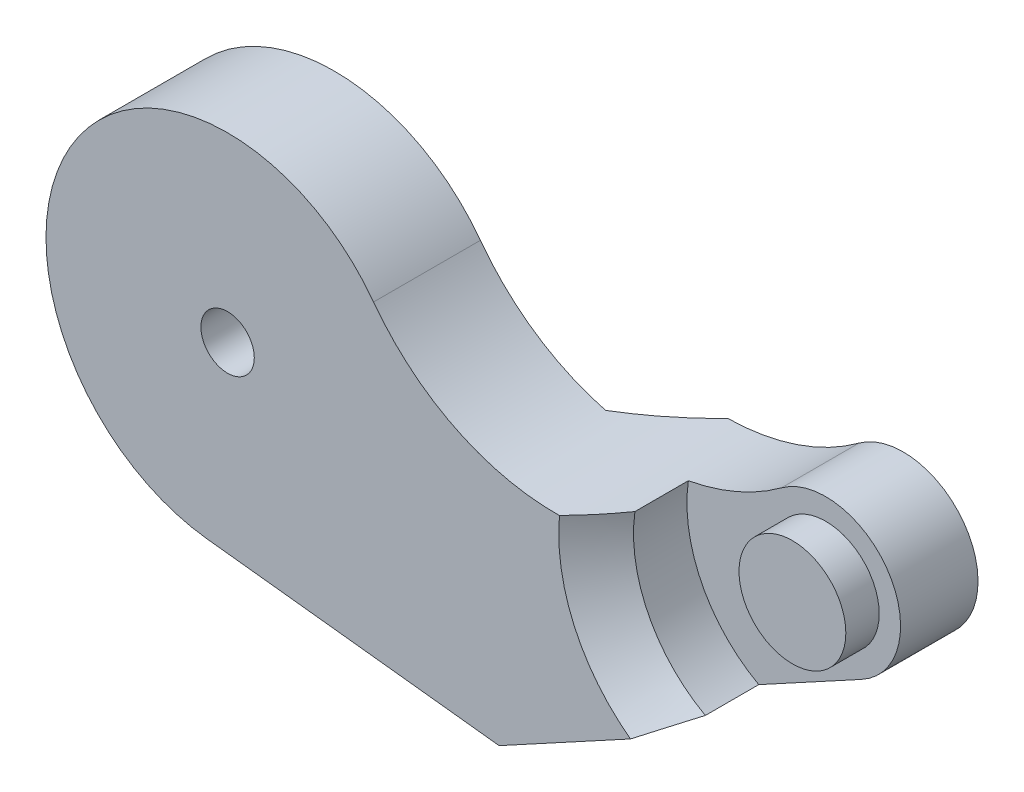
ISO-10303-21;
HEADER;
FILE_DESCRIPTION(('STEP AP214'),'2;1');
FILE_NAME('part.step','',(''),(''),'','','');
FILE_SCHEMA(('AUTOMOTIVE_DESIGN { 1 0 10303 214 1 1 1 1 }'));
ENDSEC;
DATA;
#1=APPLICATION_CONTEXT('core data for automotive mechanical design processes');
#2=APPLICATION_PROTOCOL_DEFINITION('international standard','automotive_design',2000,#1);
#3=PRODUCT_CONTEXT('',#1,'mechanical');
#4=PRODUCT('Part','Part','',(#3));
#5=PRODUCT_RELATED_PRODUCT_CATEGORY('part','',(#4));
#6=PRODUCT_DEFINITION_FORMATION('','',#4);
#7=PRODUCT_DEFINITION_CONTEXT('part definition',#1,'design');
#8=PRODUCT_DEFINITION('design','',#6,#7);
#9=PRODUCT_DEFINITION_SHAPE('','',#8);
#10=(LENGTH_UNIT() NAMED_UNIT(*) SI_UNIT(.MILLI.,.METRE.));
#11=(NAMED_UNIT(*) PLANE_ANGLE_UNIT() SI_UNIT($,.RADIAN.));
#12=(NAMED_UNIT(*) SI_UNIT($,.STERADIAN.) SOLID_ANGLE_UNIT());
#13=UNCERTAINTY_MEASURE_WITH_UNIT(LENGTH_MEASURE(1.E-05),#10,'distance_accuracy_value','');
#14=(GEOMETRIC_REPRESENTATION_CONTEXT(3) GLOBAL_UNCERTAINTY_ASSIGNED_CONTEXT((#13)) GLOBAL_UNIT_ASSIGNED_CONTEXT((#10,
#11,#12)) REPRESENTATION_CONTEXT('',''));
#15=CARTESIAN_POINT('',(0.,0.,0.));
#16=DIRECTION('',(0.,0.,1.));
#17=DIRECTION('',(1.,0.,0.));
#18=AXIS2_PLACEMENT_3D('',#15,#16,#17);
#19=CARTESIAN_POINT('',(190.,0.,-40.));
#20=DIRECTION('',(0.,0.,1.));
#21=DIRECTION('',(1.,0.,0.));
#22=AXIS2_PLACEMENT_3D('',#19,#20,#21);
#23=CYLINDRICAL_SURFACE('',#22,28.);
#24=DIRECTION('',(0.,0.,1.));
#25=VECTOR('',#24,1.);
#26=CARTESIAN_POINT('',(173.398230088496,22.5473110548789,-40.));
#27=LINE('',#26,#25);
#28=CARTESIAN_POINT('',(173.398230088496,22.5473110548789,-63.));
#29=VERTEX_POINT('',#28);
#30=CARTESIAN_POINT('',(173.398230088496,22.5473110548789,-34.));
#31=VERTEX_POINT('',#30);
#32=EDGE_CURVE('E183',#29,#31,#27,.T.);
#33=ORIENTED_EDGE('',*,*,#32,.T.);
#34=CARTESIAN_POINT('',(190.,0.,-34.));
#35=DIRECTION('',(0.,0.,1.));
#36=DIRECTION('',(1.,0.,0.));
#37=AXIS2_PLACEMENT_3D('',#34,#35,#36);
#38=CIRCLE('',#37,28.);
#39=CARTESIAN_POINT('',(203.380425875197,-24.5960200723279,-34.));
#40=VERTEX_POINT('',#39);
#41=EDGE_CURVE('E131',#31,#40,#38,.F.);
#42=ORIENTED_EDGE('',*,*,#41,.T.);
#43=DIRECTION('',(0.,0.,1.));
#44=VECTOR('',#43,1.);
#45=CARTESIAN_POINT('',(203.380425875197,-24.5960200723279,-40.));
#46=LINE('',#45,#44);
#47=CARTESIAN_POINT('',(203.380425875197,-24.5960200723279,-63.));
#48=VERTEX_POINT('',#47);
#49=EDGE_CURVE('E121',#48,#40,#46,.T.);
#50=ORIENTED_EDGE('',*,*,#49,.F.);
#51=CARTESIAN_POINT('',(190.,0.,-63.));
#52=DIRECTION('',(0.,0.,1.));
#53=DIRECTION('',(1.,0.,0.));
#54=AXIS2_PLACEMENT_3D('',#51,#52,#53);
#55=CIRCLE('',#54,28.);
#56=EDGE_CURVE('E124',#48,#29,#55,.T.);
#57=ORIENTED_EDGE('',*,*,#56,.T.);
#58=EDGE_LOOP('',(#33,#42,#50,#57));
#59=FACE_BOUND('',#58,.T.);
#60=ADVANCED_FACE('F41',(#59),#23,.T.);
#61=CARTESIAN_POINT('',(203.380425875197,-24.5960200723279,-40.));
#62=DIRECTION('',(-0.477872352685612,0.878429288297424,0.));
#63=DIRECTION('',(-0.878429288297424,-0.477872352685612,0.));
#64=AXIS2_PLACEMENT_3D('',#61,#62,#63);
#65=PLANE('',#64);
#66=DIRECTION('',(0.,0.,1.));
#67=VECTOR('',#66,1.);
#68=CARTESIAN_POINT('',(101.660038140553,-79.9327007254307,-40.));
#69=LINE('',#68,#67);
#70=CARTESIAN_POINT('',(101.660038140553,-79.9327007254307,-50.0637693932153));
#71=VERTEX_POINT('',#70);
#72=CARTESIAN_POINT('',(101.660038140553,-79.9327007254307,0.));
#73=VERTEX_POINT('',#72);
#74=EDGE_CURVE('E134',#71,#73,#69,.T.);
#75=ORIENTED_EDGE('',*,*,#74,.F.);
#76=DIRECTION('',(0.679543517203143,0.369676949123047,-0.633687274224643));
#77=VECTOR('',#76,1.);
#78=CARTESIAN_POINT('',(119.935341924948,-69.9907935829449,-67.1058382932682));
#79=LINE('',#78,#77);
#80=CARTESIAN_POINT('',(115.532388120504,-72.3860346357263,-63.));
#81=VERTEX_POINT('',#80);
#82=EDGE_CURVE('E65',#71,#81,#79,.T.);
#83=ORIENTED_EDGE('',*,*,#82,.T.);
#84=DIRECTION('',(0.878429288297424,0.477872352685612,0.));
#85=VECTOR('',#84,1.);
#86=CARTESIAN_POINT('',(203.380425875197,-24.5960200723279,-63.));
#87=LINE('',#86,#85);
#88=EDGE_CURVE('E117',#81,#48,#87,.T.);
#89=ORIENTED_EDGE('',*,*,#88,.T.);
#90=ORIENTED_EDGE('',*,*,#49,.T.);
#91=DIRECTION('',(0.878429288297424,0.477872352685612,0.));
#92=VECTOR('',#91,1.);
#93=CARTESIAN_POINT('',(203.380425875197,-24.5960200723279,-34.));
#94=LINE('',#93,#92);
#95=CARTESIAN_POINT('',(164.889582965301,-45.5353374462458,-34.));
#96=VERTEX_POINT('',#95);
#97=EDGE_CURVE('E166',#96,#40,#94,.T.);
#98=ORIENTED_EDGE('',*,*,#97,.F.);
#99=DIRECTION('',(0.,0.,1.));
#100=VECTOR('',#99,1.);
#101=CARTESIAN_POINT('',(164.889582965301,-45.5353374462458,-34.));
#102=LINE('',#101,#100);
#103=CARTESIAN_POINT('',(164.889582965301,-45.5353374462458,-14.));
#104=VERTEX_POINT('',#103);
#105=EDGE_CURVE('E160',#96,#104,#102,.T.);
#106=ORIENTED_EDGE('',*,*,#105,.T.);
#107=CARTESIAN_POINT('',(164.889582965301,-45.5353374462458,-14.));
#108=CARTESIAN_POINT('',(164.295552922547,-45.8584944013682,-13.4301454491174));
#109=CARTESIAN_POINT('',(163.70316383095,-46.1807586663217,-12.85807998458));
#110=CARTESIAN_POINT('',(162.521372217462,-46.8236624791218,-11.7099746927511));
#111=CARTESIAN_POINT('',(161.931969672641,-47.1443020394426,-11.1339348960543));
#112=CARTESIAN_POINT('',(160.755891432452,-47.784097732811,-9.97836358566463));
#113=CARTESIAN_POINT('',(160.169215533042,-48.1032539768594,-9.39883234094978));
#114=CARTESIAN_POINT('',(158.998293540993,-48.7402446312078,-8.23659633161433));
#115=CARTESIAN_POINT('',(158.414047453315,-49.0580790388096,-7.65389156052135));
#116=CARTESIAN_POINT('',(156.664641301999,-50.0097695669713,-5.9015429022758));
#117=CARTESIAN_POINT('',(155.502778358574,-50.641832028537,-4.72763022106569));
#118=CARTESIAN_POINT('',(153.765419487204,-51.5869687428759,-2.95974978929616));
#119=CARTESIAN_POINT('',(153.187182884498,-51.9015339439973,-2.36926410567707));
#120=CARTESIAN_POINT('',(152.032388240096,-52.5297511960182,-1.18617252637002));
#121=CARTESIAN_POINT('',(151.455830194224,-52.8434032491903,-0.593566635966684));
#122=CARTESIAN_POINT('',(150.880035515388,-53.1566400247676,0.));
#123=B_SPLINE_CURVE_WITH_KNOTS('',3,(#107,#108,#109,#110,#111,#112,#113,#114,#115,#116,#117,
#118,#119,#120,#121,#122),.UNSPECIFIED.,.F.,.F.,(4,2,2,2,2,2,2,4),(0.,2.65297422851289,
5.30592805700072,7.95868005330752,10.6114374619152,15.9167942925514,18.5696838608918,
21.2225668214801),.UNSPECIFIED.);
#124=CARTESIAN_POINT('',(150.880035515388,-53.1566400247676,0.));
#125=VERTEX_POINT('',#124);
#126=EDGE_CURVE('E215',#104,#125,#123,.T.);
#127=ORIENTED_EDGE('',*,*,#126,.T.);
#128=DIRECTION('',(-0.878429288297424,-0.477872352685612,0.));
#129=VECTOR('',#128,1.);
#130=CARTESIAN_POINT('',(203.380425875197,-24.5960200723279,0.));
#131=LINE('',#130,#129);
#132=EDGE_CURVE('E175',#125,#73,#131,.T.);
#133=ORIENTED_EDGE('',*,*,#132,.T.);
#134=EDGE_LOOP('',(#75,#83,#89,#90,#98,#106,#127,#133));
#135=FACE_BOUND('',#134,.T.);
#136=ADVANCED_FACE('F119',(#135),#65,.F.);
#137=CARTESIAN_POINT('',(-7.64294337863569,-67.5691158482259,-40.));
#138=DIRECTION('',(-0.112396226156407,-0.993663468356263,0.));
#139=DIRECTION('',(0.993663468356263,-0.112396226156407,0.));
#140=AXIS2_PLACEMENT_3D('',#137,#138,#139);
#141=PLANE('',#140);
#142=DIRECTION('',(0.993663468356263,-0.112396226156407,0.));
#143=VECTOR('',#142,1.);
#144=CARTESIAN_POINT('',(-7.64294337863569,-67.5691158482259,-40.));
#145=LINE('',#144,#143);
#146=CARTESIAN_POINT('',(-7.64294337863569,-67.5691158482259,-40.));
#147=VERTEX_POINT('',#146);
#148=CARTESIAN_POINT('',(91.6600381405532,-78.801571024725,-40.));
#149=VERTEX_POINT('',#148);
#150=EDGE_CURVE('E179',#147,#149,#145,.T.);
#151=ORIENTED_EDGE('',*,*,#150,.T.);
#152=DIRECTION('',(0.702626176692058,-0.0794761336949726,-0.707106781186547));
#153=VECTOR('',#152,1.);
#154=CARTESIAN_POINT('',(42.0085473809587,-73.1853434364754,9.96811530339233));
#155=LINE('',#154,#153);
#156=EDGE_CURVE('E259',#149,#71,#155,.T.);
#157=ORIENTED_EDGE('',*,*,#156,.T.);
#158=ORIENTED_EDGE('',*,*,#74,.T.);
#159=DIRECTION('',(0.993663468356263,-0.112396226156407,0.));
#160=VECTOR('',#159,1.);
#161=CARTESIAN_POINT('',(-7.64294337863569,-67.5691158482259,0.));
#162=LINE('',#161,#160);
#163=CARTESIAN_POINT('',(-7.64294337863569,-67.5691158482259,0.));
#164=VERTEX_POINT('',#163);
#165=EDGE_CURVE('E191',#164,#73,#162,.T.);
#166=ORIENTED_EDGE('',*,*,#165,.F.);
#167=DIRECTION('',(0.,0.,1.));
#168=VECTOR('',#167,1.);
#169=CARTESIAN_POINT('',(-7.64294337863569,-67.5691158482259,-40.));
#170=LINE('',#169,#168);
#171=EDGE_CURVE('E200',#147,#164,#170,.T.);
#172=ORIENTED_EDGE('',*,*,#171,.F.);
#173=EDGE_LOOP('',(#151,#157,#158,#166,#172));
#174=FACE_BOUND('',#173,.T.);
#175=ADVANCED_FACE('F233',(#174),#141,.T.);
#176=CARTESIAN_POINT('',(0.,0.,-40.));
#177=DIRECTION('',(0.,0.,1.));
#178=DIRECTION('',(1.,0.,0.));
#179=AXIS2_PLACEMENT_3D('',#176,#177,#178);
#180=CYLINDRICAL_SURFACE('',#179,68.);
#181=CARTESIAN_POINT('',(0.,0.,0.));
#182=DIRECTION('',(0.,0.,1.));
#183=DIRECTION('',(1.,0.,0.));
#184=AXIS2_PLACEMENT_3D('',#181,#182,#183);
#185=CIRCLE('',#184,68.);
#186=CARTESIAN_POINT('',(54.6666666666667,40.442002368275,0.));
#187=VERTEX_POINT('',#186);
#188=EDGE_CURVE('E187',#187,#164,#185,.T.);
#189=ORIENTED_EDGE('',*,*,#188,.F.);
#190=DIRECTION('',(0.,0.,1.));
#191=VECTOR('',#190,1.);
#192=CARTESIAN_POINT('',(54.6666666666667,40.442002368275,-40.));
#193=LINE('',#192,#191);
#194=CARTESIAN_POINT('',(54.6666666666667,40.442002368275,-40.));
#195=VERTEX_POINT('',#194);
#196=EDGE_CURVE('E203',#195,#187,#193,.T.);
#197=ORIENTED_EDGE('',*,*,#196,.F.);
#198=CARTESIAN_POINT('',(0.,0.,-40.));
#199=DIRECTION('',(0.,0.,1.));
#200=DIRECTION('',(1.,0.,0.));
#201=AXIS2_PLACEMENT_3D('',#198,#199,#200);
#202=CIRCLE('',#201,68.);
#203=EDGE_CURVE('E174',#195,#147,#202,.T.);
#204=ORIENTED_EDGE('',*,*,#203,.T.);
#205=ORIENTED_EDGE('',*,*,#171,.T.);
#206=EDGE_LOOP('',(#189,#197,#204,#205));
#207=FACE_BOUND('',#206,.T.);
#208=ADVANCED_FACE('F238',(#207),#180,.T.);
#209=CARTESIAN_POINT('',(123.,90.9945053286187,-40.));
#210=DIRECTION('',(0.,0.,1.));
#211=DIRECTION('',(1.,0.,0.));
#212=AXIS2_PLACEMENT_3D('',#209,#210,#211);
#213=CYLINDRICAL_SURFACE('',#212,85.);
#214=CARTESIAN_POINT('',(123.,90.9945053286187,-63.));
#215=DIRECTION('',(0.,0.,1.));
#216=DIRECTION('',(1.,0.,0.));
#217=AXIS2_PLACEMENT_3D('',#214,#215,#216);
#218=CIRCLE('',#217,85.);
#219=CARTESIAN_POINT('',(124.399547162441,6.00602806410883,-63.));
#220=VERTEX_POINT('',#219);
#221=EDGE_CURVE('E137',#220,#29,#218,.T.);
#222=ORIENTED_EDGE('',*,*,#221,.F.);
#223=CARTESIAN_POINT('',(123.,90.9945053286187,-52.0569370011299));
#224=DIRECTION('',(-0.702626176692058,0.0794761336949723,-0.707106781186548));
#225=DIRECTION('',(-0.702626176692058,0.0794761336949724,0.707106781186547));
#226=AXIS2_PLACEMENT_3D('',#223,#224,#225);
#227=ELLIPSE('',#226,120.208152801713,85.);
#228=CARTESIAN_POINT('',(101.562383133419,8.74227992965641,-40.));
#229=VERTEX_POINT('',#228);
#230=EDGE_CURVE('E11',#220,#229,#227,.T.);
#231=ORIENTED_EDGE('',*,*,#230,.T.);
#232=CARTESIAN_POINT('',(123.,90.9945053286187,-40.));
#233=DIRECTION('',(0.,0.,1.));
#234=DIRECTION('',(1.,0.,0.));
#235=AXIS2_PLACEMENT_3D('',#232,#233,#234);
#236=CIRCLE('',#235,85.);
#237=EDGE_CURVE('E170',#195,#229,#236,.T.);
#238=ORIENTED_EDGE('',*,*,#237,.F.);
#239=ORIENTED_EDGE('',*,*,#196,.T.);
#240=CARTESIAN_POINT('',(123.,90.9945053286187,0.));
#241=DIRECTION('',(0.,0.,1.));
#242=DIRECTION('',(1.,0.,0.));
#243=AXIS2_PLACEMENT_3D('',#240,#241,#242);
#244=CIRCLE('',#243,85.);
#245=CARTESIAN_POINT('',(124.273662784147,6.00404831659712,0.));
#246=VERTEX_POINT('',#245);
#247=EDGE_CURVE('E169',#187,#246,#244,.T.);
#248=ORIENTED_EDGE('',*,*,#247,.T.);
#249=CARTESIAN_POINT('',(124.273662784147,6.00404831659712,0.));
#250=CARTESIAN_POINT('',(124.866164425343,6.01292937421661,-0.589232965558435));
#251=CARTESIAN_POINT('',(125.458928701013,6.02800761043436,-1.17808338966176));
#252=CARTESIAN_POINT('',(126.644959599109,6.07061912934146,-2.35483072085998));
#253=CARTESIAN_POINT('',(127.238226223251,6.09815245471939,-2.94272762467984));
#254=CARTESIAN_POINT('',(129.017581179203,6.19946001592726,-4.70355344466449));
#255=CARTESIAN_POINT('',(130.204380701071,6.29195895154201,-5.87476784120689));
#256=CARTESIAN_POINT('',(131.985804610057,6.46870263969166,-7.62640888894128));
#257=CARTESIAN_POINT('',(132.579830057868,6.53395164466227,-8.20943886812819));
#258=CARTESIAN_POINT('',(133.768345752777,6.67724133151645,-9.37346117989171));
#259=CARTESIAN_POINT('',(134.36283599844,6.7552819740754,-9.95445351872691));
#260=CARTESIAN_POINT('',(135.552890395686,6.92437650242842,-11.1145753727441));
#261=CARTESIAN_POINT('',(136.148455031204,7.01544261892604,-11.6937026080541));
#262=CARTESIAN_POINT('',(137.340208757674,7.21071946000056,-12.8491039194814));
#263=CARTESIAN_POINT('',(137.936397855591,7.31493033278637,-13.4253779633525));
#264=CARTESIAN_POINT('',(138.532948345762,7.42580595087387,-14.));
#265=B_SPLINE_CURVE_WITH_KNOTS('',3,(#249,#250,#251,#252,#253,#254,#255,#256,#257,#258,#259,
#260,#261,#262,#263,#264),.UNSPECIFIED.,.F.,.F.,(4,2,2,2,2,2,2,4),(0.,2.50692977355884,
5.01386813943599,10.0228536923157,12.5274591316491,15.0320568713602,17.5390220167736,
20.0460154310883),.UNSPECIFIED.);
#266=CARTESIAN_POINT('',(138.532948345762,7.42580595087386,-14.));
#267=VERTEX_POINT('',#266);
#268=EDGE_CURVE('E248',#246,#267,#265,.T.);
#269=ORIENTED_EDGE('',*,*,#268,.T.);
#270=DIRECTION('',(0.,0.,1.));
#271=VECTOR('',#270,1.);
#272=CARTESIAN_POINT('',(138.532948345762,7.42580595087386,-17.));
#273=LINE('',#272,#271);
#274=CARTESIAN_POINT('',(138.532948345762,7.42580595087386,-34.));
#275=VERTEX_POINT('',#274);
#276=EDGE_CURVE('E157',#267,#275,#273,.F.);
#277=ORIENTED_EDGE('',*,*,#276,.T.);
#278=CARTESIAN_POINT('',(123.,90.9945053286187,-34.));
#279=DIRECTION('',(0.,0.,1.));
#280=DIRECTION('',(1.,0.,0.));
#281=AXIS2_PLACEMENT_3D('',#278,#279,#280);
#282=CIRCLE('',#281,85.);
#283=EDGE_CURVE('E133',#31,#275,#282,.F.);
#284=ORIENTED_EDGE('',*,*,#283,.F.);
#285=ORIENTED_EDGE('',*,*,#32,.F.);
#286=EDGE_LOOP('',(#222,#231,#238,#239,#248,#269,#277,#284,#285));
#287=FACE_BOUND('',#286,.T.);
#288=ADVANCED_FACE('F242',(#287),#213,.F.);
#289=CARTESIAN_POINT('',(190.,0.,-40.));
#290=DIRECTION('',(0.,0.,1.));
#291=DIRECTION('',(1.,0.,0.));
#292=AXIS2_PLACEMENT_3D('',#289,#290,#291);
#293=PLANE('',#292);
#294=CARTESIAN_POINT('',(0.,0.,-40.));
#295=DIRECTION('',(0.,0.,1.));
#296=DIRECTION('',(1.,0.,0.));
#297=AXIS2_PLACEMENT_3D('',#294,#295,#296);
#298=CIRCLE('',#297,10.);
#299=CARTESIAN_POINT('',(10.,0.,-40.));
#300=VERTEX_POINT('',#299);
#301=EDGE_CURVE('E125',#300,#300,#298,.T.);
#302=ORIENTED_EDGE('',*,*,#301,.T.);
#303=EDGE_LOOP('',(#302));
#304=FACE_BOUND('',#303,.T.);
#305=ORIENTED_EDGE('',*,*,#237,.T.);
#306=DIRECTION('',(-0.112396226156407,-0.993663468356263,0.));
#307=VECTOR('',#306,1.);
#308=CARTESIAN_POINT('',(101.703234733487,9.98750936691977,-40.));
#309=LINE('',#308,#307);
#310=EDGE_CURVE('E255',#229,#149,#309,.T.);
#311=ORIENTED_EDGE('',*,*,#310,.T.);
#312=ORIENTED_EDGE('',*,*,#150,.F.);
#313=ORIENTED_EDGE('',*,*,#203,.F.);
#314=EDGE_LOOP('',(#305,#311,#312,#313));
#315=FACE_BOUND('',#314,.T.);
#316=ADVANCED_FACE('F246',(#304,#315),#293,.F.);
#317=CARTESIAN_POINT('',(190.,0.,0.));
#318=DIRECTION('',(0.,0.,1.));
#319=DIRECTION('',(1.,0.,0.));
#320=AXIS2_PLACEMENT_3D('',#317,#318,#319);
#321=PLANE('',#320);
#322=CARTESIAN_POINT('',(0.,0.,0.));
#323=DIRECTION('',(0.,0.,1.));
#324=DIRECTION('',(1.,0.,0.));
#325=AXIS2_PLACEMENT_3D('',#322,#323,#324);
#326=CIRCLE('',#325,10.);
#327=CARTESIAN_POINT('',(10.,0.,0.));
#328=VERTEX_POINT('',#327);
#329=EDGE_CURVE('E423',#328,#328,#326,.T.);
#330=ORIENTED_EDGE('',*,*,#329,.F.);
#331=EDGE_LOOP('',(#330));
#332=FACE_BOUND('',#331,.T.);
#333=ORIENTED_EDGE('',*,*,#132,.F.);
#334=CARTESIAN_POINT('',(190.,0.,0.));
#335=DIRECTION('',(0.,0.,1.));
#336=DIRECTION('',(1.,0.,0.));
#337=AXIS2_PLACEMENT_3D('',#334,#335,#336);
#338=CIRCLE('',#337,66.);
#339=EDGE_CURVE('E223',#125,#246,#338,.F.);
#340=ORIENTED_EDGE('',*,*,#339,.T.);
#341=ORIENTED_EDGE('',*,*,#247,.F.);
#342=ORIENTED_EDGE('',*,*,#188,.T.);
#343=ORIENTED_EDGE('',*,*,#165,.T.);
#344=EDGE_LOOP('',(#333,#340,#341,#342,#343));
#345=FACE_BOUND('',#344,.T.);
#346=ADVANCED_FACE('F234',(#332,#345),#321,.T.);
#347=CARTESIAN_POINT('',(190.,0.,-34.));
#348=DIRECTION('',(0.,0.,1.));
#349=DIRECTION('',(1.,0.,0.));
#350=AXIS2_PLACEMENT_3D('',#347,#348,#349);
#351=PLANE('',#350);
#352=CARTESIAN_POINT('',(190.,0.,-34.));
#353=DIRECTION('',(0.,0.,1.));
#354=DIRECTION('',(1.,0.,0.));
#355=AXIS2_PLACEMENT_3D('',#352,#353,#354);
#356=CIRCLE('',#355,20.);
#357=CARTESIAN_POINT('',(210.,0.,-34.));
#358=VERTEX_POINT('',#357);
#359=EDGE_CURVE('E142',#358,#358,#356,.T.);
#360=ORIENTED_EDGE('',*,*,#359,.F.);
#361=EDGE_LOOP('',(#360));
#362=FACE_BOUND('',#361,.T.);
#363=ORIENTED_EDGE('',*,*,#97,.T.);
#364=ORIENTED_EDGE('',*,*,#41,.F.);
#365=ORIENTED_EDGE('',*,*,#283,.T.);
#366=CARTESIAN_POINT('',(190.,0.,-34.));
#367=DIRECTION('',(0.,0.,1.));
#368=DIRECTION('',(1.,0.,0.));
#369=AXIS2_PLACEMENT_3D('',#366,#367,#368);
#370=CIRCLE('',#369,52.);
#371=EDGE_CURVE('E150',#275,#96,#370,.T.);
#372=ORIENTED_EDGE('',*,*,#371,.T.);
#373=EDGE_LOOP('',(#363,#364,#365,#372));
#374=FACE_BOUND('',#373,.T.);
#375=ADVANCED_FACE('F279',(#362,#374),#351,.T.);
#376=CARTESIAN_POINT('',(190.,0.,-34.));
#377=DIRECTION('',(0.,0.,1.));
#378=DIRECTION('',(1.,0.,0.));
#379=AXIS2_PLACEMENT_3D('',#376,#377,#378);
#380=CYLINDRICAL_SURFACE('',#379,52.);
#381=ORIENTED_EDGE('',*,*,#276,.F.);
#382=CARTESIAN_POINT('',(190.,0.,-14.));
#383=DIRECTION('',(0.,0.,1.));
#384=DIRECTION('',(1.,0.,0.));
#385=AXIS2_PLACEMENT_3D('',#382,#383,#384);
#386=CIRCLE('',#385,52.);
#387=EDGE_CURVE('E211',#267,#104,#386,.T.);
#388=ORIENTED_EDGE('',*,*,#387,.T.);
#389=ORIENTED_EDGE('',*,*,#105,.F.);
#390=ORIENTED_EDGE('',*,*,#371,.F.);
#391=EDGE_LOOP('',(#381,#388,#389,#390));
#392=FACE_BOUND('',#391,.T.);
#393=ADVANCED_FACE('F276',(#392),#380,.F.);
#394=CARTESIAN_POINT('',(190.,0.,-21.5));
#395=DIRECTION('',(0.,0.,-1.));
#396=DIRECTION('',(-1.,0.,0.));
#397=AXIS2_PLACEMENT_3D('',#394,#395,#396);
#398=CYLINDRICAL_SURFACE('',#397,20.);
#399=CARTESIAN_POINT('',(190.,0.,-21.5));
#400=DIRECTION('',(0.,0.,1.));
#401=DIRECTION('',(1.,0.,0.));
#402=AXIS2_PLACEMENT_3D('',#399,#400,#401);
#403=CIRCLE('',#402,20.);
#404=CARTESIAN_POINT('',(210.,0.,-21.5));
#405=VERTEX_POINT('',#404);
#406=EDGE_CURVE('E146',#405,#405,#403,.T.);
#407=ORIENTED_EDGE('',*,*,#406,.F.);
#408=EDGE_LOOP('',(#407));
#409=FACE_BOUND('',#408,.T.);
#410=ORIENTED_EDGE('',*,*,#359,.T.);
#411=EDGE_LOOP('',(#410));
#412=FACE_BOUND('',#411,.T.);
#413=ADVANCED_FACE('F366',(#409,#412),#398,.T.);
#414=CARTESIAN_POINT('',(190.,0.,-21.5));
#415=DIRECTION('',(0.,0.,1.));
#416=DIRECTION('',(1.,0.,0.));
#417=AXIS2_PLACEMENT_3D('',#414,#415,#416);
#418=PLANE('',#417);
#419=ORIENTED_EDGE('',*,*,#406,.T.);
#420=EDGE_LOOP('',(#419));
#421=FACE_BOUND('',#420,.T.);
#422=ADVANCED_FACE('F363',(#421),#418,.T.);
#423=CARTESIAN_POINT('',(190.,0.,-14.));
#424=DIRECTION('',(0.,0.,1.));
#425=DIRECTION('',(1.,0.,0.));
#426=AXIS2_PLACEMENT_3D('',#423,#424,#425);
#427=CONICAL_SURFACE('',#426,52.,0.785398163397449);
#428=ORIENTED_EDGE('',*,*,#268,.F.);
#429=ORIENTED_EDGE('',*,*,#339,.F.);
#430=ORIENTED_EDGE('',*,*,#126,.F.);
#431=ORIENTED_EDGE('',*,*,#387,.F.);
#432=EDGE_LOOP('',(#428,#429,#430,#431));
#433=FACE_BOUND('',#432,.T.);
#434=ADVANCED_FACE('F226',(#433),#427,.F.);
#435=CARTESIAN_POINT('',(190.,0.,-63.));
#436=DIRECTION('',(0.,0.,1.));
#437=DIRECTION('',(1.,0.,0.));
#438=AXIS2_PLACEMENT_3D('',#435,#436,#437);
#439=PLANE('',#438);
#440=ORIENTED_EDGE('',*,*,#88,.F.);
#441=DIRECTION('',(0.112396226156407,0.993663468356263,0.));
#442=VECTOR('',#441,1.);
#443=CARTESIAN_POINT('',(124.416642905613,6.15716672805904,-63.));
#444=LINE('',#443,#442);
#445=EDGE_CURVE('E51',#81,#220,#444,.T.);
#446=ORIENTED_EDGE('',*,*,#445,.T.);
#447=ORIENTED_EDGE('',*,*,#221,.T.);
#448=ORIENTED_EDGE('',*,*,#56,.F.);
#449=EDGE_LOOP('',(#440,#446,#447,#448));
#450=FACE_BOUND('',#449,.T.);
#451=ADVANCED_FACE('F136',(#450),#439,.F.);
#452=CARTESIAN_POINT('',(101.703234733487,9.98750936691977,-40.));
#453=DIRECTION('',(-0.702626176692058,0.0794761336949723,-0.707106781186548));
#454=DIRECTION('',(0.112396226156407,0.993663468356263,0.));
#455=AXIS2_PLACEMENT_3D('',#452,#453,#454);
#456=PLANE('',#455);
#457=ORIENTED_EDGE('',*,*,#230,.F.);
#458=ORIENTED_EDGE('',*,*,#445,.F.);
#459=ORIENTED_EDGE('',*,*,#82,.F.);
#460=ORIENTED_EDGE('',*,*,#156,.F.);
#461=ORIENTED_EDGE('',*,*,#310,.F.);
#462=EDGE_LOOP('',(#457,#458,#459,#460,#461));
#463=FACE_BOUND('',#462,.T.);
#464=ADVANCED_FACE('F44',(#463),#456,.T.);
#465=CARTESIAN_POINT('',(0.,0.,-122.));
#466=DIRECTION('',(0.,0.,1.));
#467=DIRECTION('',(1.,0.,0.));
#468=AXIS2_PLACEMENT_3D('',#465,#466,#467);
#469=CYLINDRICAL_SURFACE('',#468,10.);
#470=ORIENTED_EDGE('',*,*,#329,.T.);
#471=EDGE_LOOP('',(#470));
#472=FACE_BOUND('',#471,.T.);
#473=ORIENTED_EDGE('',*,*,#301,.F.);
#474=EDGE_LOOP('',(#473));
#475=FACE_BOUND('',#474,.T.);
#476=ADVANCED_FACE('F335',(#472,#475),#469,.F.);
#477=CLOSED_SHELL('',(#60,#136,#175,#208,#288,#316,#346,#375,#393,#413,#422,#434,#451,#464,#476));
#478=MANIFOLD_SOLID_BREP('B2',#477);
#479=ADVANCED_BREP_SHAPE_REPRESENTATION('',(#18,#478),#14);
#480=SHAPE_DEFINITION_REPRESENTATION(#9,#479);
ENDSEC;
END-ISO-10303-21;
